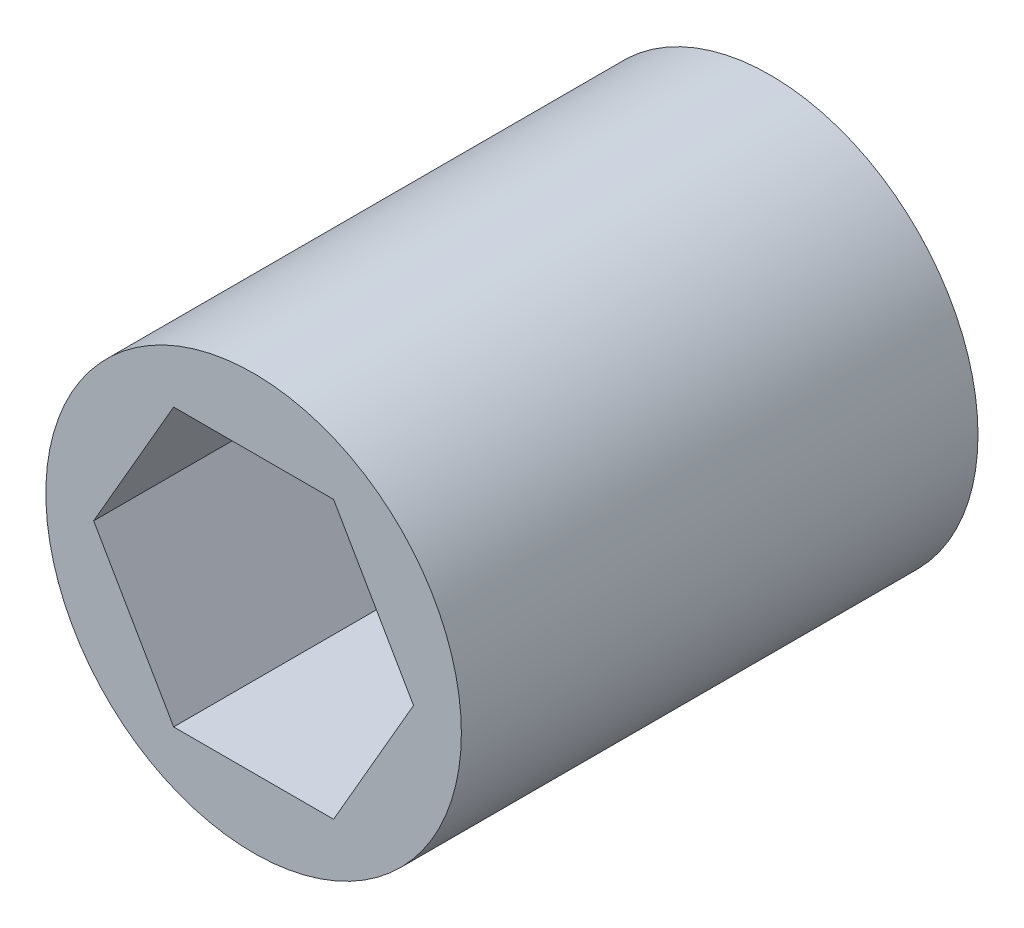
ISO-10303-21;
HEADER;
FILE_DESCRIPTION(('STEP AP214'),'2;1');
FILE_NAME('part.step','',(''),(''),'','','');
FILE_SCHEMA(('AUTOMOTIVE_DESIGN { 1 0 10303 214 1 1 1 1 }'));
ENDSEC;
DATA;
#1=APPLICATION_CONTEXT('core data for automotive mechanical design processes');
#2=APPLICATION_PROTOCOL_DEFINITION('international standard','automotive_design',2000,#1);
#3=PRODUCT_CONTEXT('',#1,'mechanical');
#4=PRODUCT('Part','Part','',(#3));
#5=PRODUCT_RELATED_PRODUCT_CATEGORY('part','',(#4));
#6=PRODUCT_DEFINITION_FORMATION('','',#4);
#7=PRODUCT_DEFINITION_CONTEXT('part definition',#1,'design');
#8=PRODUCT_DEFINITION('design','',#6,#7);
#9=PRODUCT_DEFINITION_SHAPE('','',#8);
#10=(LENGTH_UNIT() NAMED_UNIT(*) SI_UNIT(.MILLI.,.METRE.));
#11=(NAMED_UNIT(*) PLANE_ANGLE_UNIT() SI_UNIT($,.RADIAN.));
#12=(NAMED_UNIT(*) SI_UNIT($,.STERADIAN.) SOLID_ANGLE_UNIT());
#13=UNCERTAINTY_MEASURE_WITH_UNIT(LENGTH_MEASURE(1.E-05),#10,'distance_accuracy_value','');
#14=(GEOMETRIC_REPRESENTATION_CONTEXT(3) GLOBAL_UNCERTAINTY_ASSIGNED_CONTEXT((#13)) GLOBAL_UNIT_ASSIGNED_CONTEXT((#10,
#11,#12)) REPRESENTATION_CONTEXT('',''));
#15=CARTESIAN_POINT('',(0.,0.,0.));
#16=DIRECTION('',(0.,0.,1.));
#17=DIRECTION('',(1.,0.,0.));
#18=AXIS2_PLACEMENT_3D('',#15,#16,#17);
#19=CARTESIAN_POINT('',(0.,0.,23.6855));
#20=DIRECTION('',(0.,0.,1.));
#21=DIRECTION('',(1.,0.,0.));
#22=AXIS2_PLACEMENT_3D('',#19,#20,#21);
#23=PLANE('',#22);
#24=CARTESIAN_POINT('',(0.,0.,23.6855));
#25=DIRECTION('',(0.,0.,1.));
#26=DIRECTION('',(1.,0.,0.));
#27=AXIS2_PLACEMENT_3D('',#24,#25,#26);
#28=CIRCLE('',#27,9.525);
#29=CARTESIAN_POINT('',(9.525,0.,23.6855));
#30=VERTEX_POINT('',#29);
#31=EDGE_CURVE('E12',#30,#30,#28,.T.);
#32=ORIENTED_EDGE('',*,*,#31,.T.);
#33=EDGE_LOOP('',(#32));
#34=FACE_BOUND('',#33,.T.);
#35=DIRECTION('',(0.5,0.866025403784439,0.));
#36=VECTOR('',#35,1.);
#37=CARTESIAN_POINT('',(5.49926131403119,-3.175,23.6855));
#38=LINE('',#37,#36);
#39=CARTESIAN_POINT('',(3.66617420935413,-6.35,23.6855));
#40=VERTEX_POINT('',#39);
#41=CARTESIAN_POINT('',(7.33234841870825,0.,23.6855));
#42=VERTEX_POINT('',#41);
#43=EDGE_CURVE('E133',#40,#42,#38,.T.);
#44=ORIENTED_EDGE('',*,*,#43,.F.);
#45=DIRECTION('',(1.,0.,0.));
#46=VECTOR('',#45,1.);
#47=CARTESIAN_POINT('',(0.,-6.35,23.6855));
#48=LINE('',#47,#46);
#49=CARTESIAN_POINT('',(-3.66617420935412,-6.35,23.6855));
#50=VERTEX_POINT('',#49);
#51=EDGE_CURVE('E124',#50,#40,#48,.T.);
#52=ORIENTED_EDGE('',*,*,#51,.F.);
#53=DIRECTION('',(0.5,-0.866025403784439,0.));
#54=VECTOR('',#53,1.);
#55=CARTESIAN_POINT('',(-5.49926131403118,-3.175,23.6855));
#56=LINE('',#55,#54);
#57=CARTESIAN_POINT('',(-7.33234841870825,0.,23.6855));
#58=VERTEX_POINT('',#57);
#59=EDGE_CURVE('E158',#58,#50,#56,.T.);
#60=ORIENTED_EDGE('',*,*,#59,.F.);
#61=DIRECTION('',(-0.5,-0.866025403784439,0.));
#62=VECTOR('',#61,1.);
#63=CARTESIAN_POINT('',(-5.49926131403118,3.175,23.6855));
#64=LINE('',#63,#62);
#65=CARTESIAN_POINT('',(-3.66617420935412,6.35,23.6855));
#66=VERTEX_POINT('',#65);
#67=EDGE_CURVE('E155',#66,#58,#64,.T.);
#68=ORIENTED_EDGE('',*,*,#67,.F.);
#69=DIRECTION('',(-1.,0.,0.));
#70=VECTOR('',#69,1.);
#71=CARTESIAN_POINT('',(0.,6.35,23.6855));
#72=LINE('',#71,#70);
#73=CARTESIAN_POINT('',(3.66617420935412,6.35,23.6855));
#74=VERTEX_POINT('',#73);
#75=EDGE_CURVE('E150',#74,#66,#72,.T.);
#76=ORIENTED_EDGE('',*,*,#75,.F.);
#77=DIRECTION('',(-0.5,0.866025403784439,0.));
#78=VECTOR('',#77,1.);
#79=CARTESIAN_POINT('',(5.49926131403118,3.175,23.6855));
#80=LINE('',#79,#78);
#81=EDGE_CURVE('E146',#42,#74,#80,.T.);
#82=ORIENTED_EDGE('',*,*,#81,.F.);
#83=EDGE_LOOP('',(#44,#52,#60,#68,#76,#82));
#84=FACE_BOUND('',#83,.T.);
#85=ADVANCED_FACE('F70',(#34,#84),#23,.T.);
#86=CARTESIAN_POINT('',(0.,0.,0.));
#87=DIRECTION('',(0.,0.,1.));
#88=DIRECTION('',(1.,0.,0.));
#89=AXIS2_PLACEMENT_3D('',#86,#87,#88);
#90=PLANE('',#89);
#91=CARTESIAN_POINT('',(0.,0.,0.));
#92=DIRECTION('',(0.,0.,1.));
#93=DIRECTION('',(1.,0.,0.));
#94=AXIS2_PLACEMENT_3D('',#91,#92,#93);
#95=CIRCLE('',#94,9.525);
#96=CARTESIAN_POINT('',(9.525,0.,0.));
#97=VERTEX_POINT('',#96);
#98=EDGE_CURVE('E74',#97,#97,#95,.T.);
#99=ORIENTED_EDGE('',*,*,#98,.F.);
#100=EDGE_LOOP('',(#99));
#101=FACE_BOUND('',#100,.T.);
#102=DIRECTION('',(1.,0.,0.));
#103=VECTOR('',#102,1.);
#104=CARTESIAN_POINT('',(0.,-6.35,0.));
#105=LINE('',#104,#103);
#106=CARTESIAN_POINT('',(-3.66617420935412,-6.35,0.));
#107=VERTEX_POINT('',#106);
#108=CARTESIAN_POINT('',(3.66617420935413,-6.35,0.));
#109=VERTEX_POINT('',#108);
#110=EDGE_CURVE('E94',#107,#109,#105,.T.);
#111=ORIENTED_EDGE('',*,*,#110,.T.);
#112=DIRECTION('',(0.5,0.866025403784439,0.));
#113=VECTOR('',#112,1.);
#114=CARTESIAN_POINT('',(5.49926131403119,-3.175,0.));
#115=LINE('',#114,#113);
#116=CARTESIAN_POINT('',(7.33234841870825,0.,0.));
#117=VERTEX_POINT('',#116);
#118=EDGE_CURVE('E140',#109,#117,#115,.T.);
#119=ORIENTED_EDGE('',*,*,#118,.T.);
#120=DIRECTION('',(-0.5,0.866025403784439,0.));
#121=VECTOR('',#120,1.);
#122=CARTESIAN_POINT('',(5.49926131403118,3.175,0.));
#123=LINE('',#122,#121);
#124=CARTESIAN_POINT('',(3.66617420935412,6.35,0.));
#125=VERTEX_POINT('',#124);
#126=EDGE_CURVE('E165',#117,#125,#123,.T.);
#127=ORIENTED_EDGE('',*,*,#126,.T.);
#128=DIRECTION('',(-1.,0.,0.));
#129=VECTOR('',#128,1.);
#130=CARTESIAN_POINT('',(0.,6.35,0.));
#131=LINE('',#130,#129);
#132=CARTESIAN_POINT('',(-3.66617420935412,6.35,0.));
#133=VERTEX_POINT('',#132);
#134=EDGE_CURVE('E169',#125,#133,#131,.T.);
#135=ORIENTED_EDGE('',*,*,#134,.T.);
#136=DIRECTION('',(-0.5,-0.866025403784439,0.));
#137=VECTOR('',#136,1.);
#138=CARTESIAN_POINT('',(-5.49926131403118,3.175,0.));
#139=LINE('',#138,#137);
#140=CARTESIAN_POINT('',(-7.33234841870825,0.,0.));
#141=VERTEX_POINT('',#140);
#142=EDGE_CURVE('E173',#133,#141,#139,.T.);
#143=ORIENTED_EDGE('',*,*,#142,.T.);
#144=DIRECTION('',(0.5,-0.866025403784439,0.));
#145=VECTOR('',#144,1.);
#146=CARTESIAN_POINT('',(-5.49926131403118,-3.175,0.));
#147=LINE('',#146,#145);
#148=EDGE_CURVE('E134',#141,#107,#147,.T.);
#149=ORIENTED_EDGE('',*,*,#148,.T.);
#150=EDGE_LOOP('',(#111,#119,#127,#135,#143,#149));
#151=FACE_BOUND('',#150,.T.);
#152=ADVANCED_FACE('F197',(#101,#151),#90,.F.);
#153=CARTESIAN_POINT('',(0.,0.,23.6855));
#154=DIRECTION('',(0.,0.,-1.));
#155=DIRECTION('',(-1.,0.,0.));
#156=AXIS2_PLACEMENT_3D('',#153,#154,#155);
#157=CYLINDRICAL_SURFACE('',#156,9.525);
#158=ORIENTED_EDGE('',*,*,#31,.F.);
#159=EDGE_LOOP('',(#158));
#160=FACE_BOUND('',#159,.T.);
#161=ORIENTED_EDGE('',*,*,#98,.T.);
#162=EDGE_LOOP('',(#161));
#163=FACE_BOUND('',#162,.T.);
#164=ADVANCED_FACE('F72',(#160,#163),#157,.T.);
#165=CARTESIAN_POINT('',(0.,-6.35,23.6855));
#166=DIRECTION('',(0.,1.,0.));
#167=DIRECTION('',(0.,0.,1.));
#168=AXIS2_PLACEMENT_3D('',#165,#166,#167);
#169=PLANE('',#168);
#170=ORIENTED_EDGE('',*,*,#110,.F.);
#171=DIRECTION('',(0.,0.,-1.));
#172=VECTOR('',#171,1.);
#173=CARTESIAN_POINT('',(-3.66617420935412,-6.35,23.6855));
#174=LINE('',#173,#172);
#175=EDGE_CURVE('E128',#50,#107,#174,.T.);
#176=ORIENTED_EDGE('',*,*,#175,.F.);
#177=ORIENTED_EDGE('',*,*,#51,.T.);
#178=DIRECTION('',(0.,0.,-1.));
#179=VECTOR('',#178,1.);
#180=CARTESIAN_POINT('',(3.66617420935413,-6.35,23.6855));
#181=LINE('',#180,#179);
#182=EDGE_CURVE('E127',#40,#109,#181,.T.);
#183=ORIENTED_EDGE('',*,*,#182,.T.);
#184=EDGE_LOOP('',(#170,#176,#177,#183));
#185=FACE_BOUND('',#184,.T.);
#186=ADVANCED_FACE('F126',(#185),#169,.T.);
#187=CARTESIAN_POINT('',(5.49926131403119,-3.175,23.6855));
#188=DIRECTION('',(-0.866025403784439,0.5,0.));
#189=DIRECTION('',(-0.5,-0.866025403784439,0.));
#190=AXIS2_PLACEMENT_3D('',#187,#188,#189);
#191=PLANE('',#190);
#192=ORIENTED_EDGE('',*,*,#118,.F.);
#193=ORIENTED_EDGE('',*,*,#182,.F.);
#194=ORIENTED_EDGE('',*,*,#43,.T.);
#195=DIRECTION('',(0.,0.,-1.));
#196=VECTOR('',#195,1.);
#197=CARTESIAN_POINT('',(7.33234841870825,0.,23.6855));
#198=LINE('',#197,#196);
#199=EDGE_CURVE('E142',#42,#117,#198,.T.);
#200=ORIENTED_EDGE('',*,*,#199,.T.);
#201=EDGE_LOOP('',(#192,#193,#194,#200));
#202=FACE_BOUND('',#201,.T.);
#203=ADVANCED_FACE('F137',(#202),#191,.T.);
#204=CARTESIAN_POINT('',(5.49926131403118,3.175,23.6855));
#205=DIRECTION('',(-0.866025403784438,-0.5,0.));
#206=DIRECTION('',(0.5,-0.866025403784439,0.));
#207=AXIS2_PLACEMENT_3D('',#204,#205,#206);
#208=PLANE('',#207);
#209=ORIENTED_EDGE('',*,*,#126,.F.);
#210=ORIENTED_EDGE('',*,*,#199,.F.);
#211=ORIENTED_EDGE('',*,*,#81,.T.);
#212=DIRECTION('',(0.,0.,-1.));
#213=VECTOR('',#212,1.);
#214=CARTESIAN_POINT('',(3.66617420935412,6.35,23.6855));
#215=LINE('',#214,#213);
#216=EDGE_CURVE('E187',#74,#125,#215,.T.);
#217=ORIENTED_EDGE('',*,*,#216,.T.);
#218=EDGE_LOOP('',(#209,#210,#211,#217));
#219=FACE_BOUND('',#218,.T.);
#220=ADVANCED_FACE('F193',(#219),#208,.T.);
#221=CARTESIAN_POINT('',(0.,6.35,23.6855));
#222=DIRECTION('',(0.,-1.,0.));
#223=DIRECTION('',(1.,0.,0.));
#224=AXIS2_PLACEMENT_3D('',#221,#222,#223);
#225=PLANE('',#224);
#226=ORIENTED_EDGE('',*,*,#134,.F.);
#227=ORIENTED_EDGE('',*,*,#216,.F.);
#228=ORIENTED_EDGE('',*,*,#75,.T.);
#229=DIRECTION('',(0.,0.,-1.));
#230=VECTOR('',#229,1.);
#231=CARTESIAN_POINT('',(-3.66617420935412,6.35,23.6855));
#232=LINE('',#231,#230);
#233=EDGE_CURVE('E184',#66,#133,#232,.T.);
#234=ORIENTED_EDGE('',*,*,#233,.T.);
#235=EDGE_LOOP('',(#226,#227,#228,#234));
#236=FACE_BOUND('',#235,.T.);
#237=ADVANCED_FACE('F205',(#236),#225,.T.);
#238=CARTESIAN_POINT('',(-5.49926131403118,3.175,23.6855));
#239=DIRECTION('',(0.866025403784439,-0.5,0.));
#240=DIRECTION('',(0.5,0.866025403784439,0.));
#241=AXIS2_PLACEMENT_3D('',#238,#239,#240);
#242=PLANE('',#241);
#243=ORIENTED_EDGE('',*,*,#142,.F.);
#244=ORIENTED_EDGE('',*,*,#233,.F.);
#245=ORIENTED_EDGE('',*,*,#67,.T.);
#246=DIRECTION('',(0.,0.,-1.));
#247=VECTOR('',#246,1.);
#248=CARTESIAN_POINT('',(-7.33234841870825,0.,23.6855));
#249=LINE('',#248,#247);
#250=EDGE_CURVE('E86',#58,#141,#249,.T.);
#251=ORIENTED_EDGE('',*,*,#250,.T.);
#252=EDGE_LOOP('',(#243,#244,#245,#251));
#253=FACE_BOUND('',#252,.T.);
#254=ADVANCED_FACE('F203',(#253),#242,.T.);
#255=CARTESIAN_POINT('',(-5.49926131403118,-3.175,23.6855));
#256=DIRECTION('',(0.866025403784438,0.5,0.));
#257=DIRECTION('',(-0.5,0.866025403784439,0.));
#258=AXIS2_PLACEMENT_3D('',#255,#256,#257);
#259=PLANE('',#258);
#260=ORIENTED_EDGE('',*,*,#148,.F.);
#261=ORIENTED_EDGE('',*,*,#250,.F.);
#262=ORIENTED_EDGE('',*,*,#59,.T.);
#263=ORIENTED_EDGE('',*,*,#175,.T.);
#264=EDGE_LOOP('',(#260,#261,#262,#263));
#265=FACE_BOUND('',#264,.T.);
#266=ADVANCED_FACE('F199',(#265),#259,.T.);
#267=CLOSED_SHELL('',(#85,#152,#164,#186,#203,#220,#237,#254,#266));
#268=MANIFOLD_SOLID_BREP('B2',#267);
#269=ADVANCED_BREP_SHAPE_REPRESENTATION('',(#18,#268),#14);
#270=SHAPE_DEFINITION_REPRESENTATION(#9,#269);
ENDSEC;
END-ISO-10303-21;
